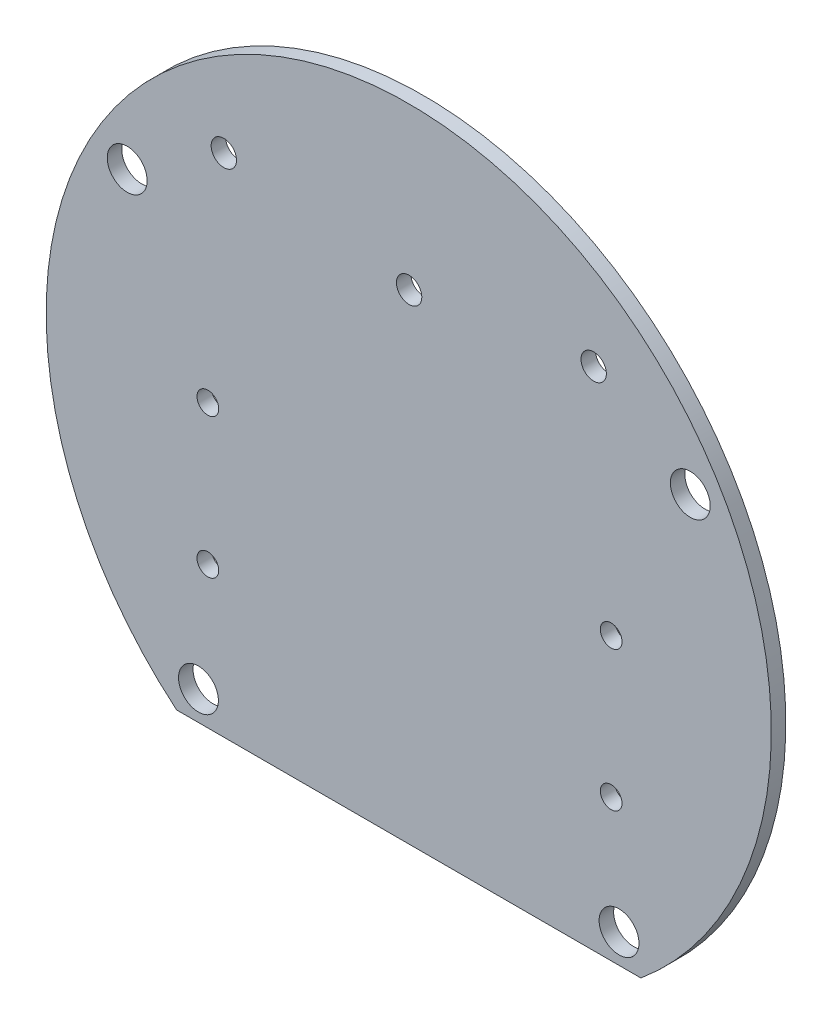
ISO-10303-21;
HEADER;
FILE_DESCRIPTION(('STEP AP214'),'2;1');
FILE_NAME('part.step','',(''),(''),'','','');
FILE_SCHEMA(('AUTOMOTIVE_DESIGN { 1 0 10303 214 1 1 1 1 }'));
ENDSEC;
DATA;
#1=APPLICATION_CONTEXT('core data for automotive mechanical design processes');
#2=APPLICATION_PROTOCOL_DEFINITION('international standard','automotive_design',2000,#1);
#3=PRODUCT_CONTEXT('',#1,'mechanical');
#4=PRODUCT('Part','Part','',(#3));
#5=PRODUCT_RELATED_PRODUCT_CATEGORY('part','',(#4));
#6=PRODUCT_DEFINITION_FORMATION('','',#4);
#7=PRODUCT_DEFINITION_CONTEXT('part definition',#1,'design');
#8=PRODUCT_DEFINITION('design','',#6,#7);
#9=PRODUCT_DEFINITION_SHAPE('','',#8);
#10=(LENGTH_UNIT() NAMED_UNIT(*) SI_UNIT(.MILLI.,.METRE.));
#11=(NAMED_UNIT(*) PLANE_ANGLE_UNIT() SI_UNIT($,.RADIAN.));
#12=(NAMED_UNIT(*) SI_UNIT($,.STERADIAN.) SOLID_ANGLE_UNIT());
#13=UNCERTAINTY_MEASURE_WITH_UNIT(LENGTH_MEASURE(1.E-05),#10,'distance_accuracy_value','');
#14=(GEOMETRIC_REPRESENTATION_CONTEXT(3) GLOBAL_UNCERTAINTY_ASSIGNED_CONTEXT((#13)) GLOBAL_UNIT_ASSIGNED_CONTEXT((#10,
#11,#12)) REPRESENTATION_CONTEXT('',''));
#15=CARTESIAN_POINT('',(0.,0.,0.));
#16=DIRECTION('',(0.,0.,1.));
#17=DIRECTION('',(1.,0.,0.));
#18=AXIS2_PLACEMENT_3D('',#15,#16,#17);
#19=CARTESIAN_POINT('',(0.,0.,2.));
#20=DIRECTION('',(0.,0.,-1.));
#21=DIRECTION('',(-1.,0.,0.));
#22=AXIS2_PLACEMENT_3D('',#19,#20,#21);
#23=CYLINDRICAL_SURFACE('',#22,50.);
#24=DIRECTION('',(0.,0.,-1.));
#25=VECTOR('',#24,1.);
#26=CARTESIAN_POINT('',(-32.0113353588168,-38.4093010681705,2.));
#27=LINE('',#26,#25);
#28=CARTESIAN_POINT('',(-32.0113353588168,-38.4093010681705,2.));
#29=VERTEX_POINT('',#28);
#30=CARTESIAN_POINT('',(-32.0113353588168,-38.4093010681705,0.));
#31=VERTEX_POINT('',#30);
#32=EDGE_CURVE('E55',#29,#31,#27,.T.);
#33=ORIENTED_EDGE('',*,*,#32,.F.);
#34=CARTESIAN_POINT('',(0.,0.,2.));
#35=DIRECTION('',(0.,0.,1.));
#36=DIRECTION('',(1.,0.,0.));
#37=AXIS2_PLACEMENT_3D('',#34,#35,#36);
#38=CIRCLE('',#37,50.);
#39=CARTESIAN_POINT('',(32.0113353588168,-38.4093010681705,2.));
#40=VERTEX_POINT('',#39);
#41=EDGE_CURVE('E49',#40,#29,#38,.T.);
#42=ORIENTED_EDGE('',*,*,#41,.F.);
#43=DIRECTION('',(0.,0.,-1.));
#44=VECTOR('',#43,1.);
#45=CARTESIAN_POINT('',(32.0113353588168,-38.4093010681705,2.));
#46=LINE('',#45,#44);
#47=CARTESIAN_POINT('',(32.0113353588168,-38.4093010681705,0.));
#48=VERTEX_POINT('',#47);
#49=EDGE_CURVE('E66',#48,#40,#46,.F.);
#50=ORIENTED_EDGE('',*,*,#49,.F.);
#51=CARTESIAN_POINT('',(0.,0.,0.));
#52=DIRECTION('',(0.,0.,1.));
#53=DIRECTION('',(1.,0.,0.));
#54=AXIS2_PLACEMENT_3D('',#51,#52,#53);
#55=CIRCLE('',#54,50.);
#56=EDGE_CURVE('E72',#48,#31,#55,.T.);
#57=ORIENTED_EDGE('',*,*,#56,.T.);
#58=EDGE_LOOP('',(#33,#42,#50,#57));
#59=FACE_BOUND('',#58,.T.);
#60=ADVANCED_FACE('F41',(#59),#23,.T.);
#61=CARTESIAN_POINT('',(0.,0.,2.));
#62=DIRECTION('',(0.,0.,1.));
#63=DIRECTION('',(1.,0.,0.));
#64=AXIS2_PLACEMENT_3D('',#61,#62,#63);
#65=PLANE('',#64);
#66=CARTESIAN_POINT('',(25.5,31.36,2.));
#67=DIRECTION('',(0.,0.,1.));
#68=DIRECTION('',(1.,0.,0.));
#69=AXIS2_PLACEMENT_3D('',#66,#67,#68);
#70=CIRCLE('',#69,1.75);
#71=CARTESIAN_POINT('',(27.25,31.36,2.));
#72=VERTEX_POINT('',#71);
#73=EDGE_CURVE('E75',#72,#72,#70,.T.);
#74=ORIENTED_EDGE('',*,*,#73,.F.);
#75=EDGE_LOOP('',(#74));
#76=FACE_BOUND('',#75,.T.);
#77=CARTESIAN_POINT('',(-25.5,31.36,2.));
#78=DIRECTION('',(0.,0.,1.));
#79=DIRECTION('',(1.,0.,0.));
#80=AXIS2_PLACEMENT_3D('',#77,#78,#79);
#81=CIRCLE('',#80,1.75);
#82=CARTESIAN_POINT('',(-23.75,31.36,2.));
#83=VERTEX_POINT('',#82);
#84=EDGE_CURVE('E121',#83,#83,#81,.T.);
#85=ORIENTED_EDGE('',*,*,#84,.F.);
#86=EDGE_LOOP('',(#85));
#87=FACE_BOUND('',#86,.T.);
#88=CARTESIAN_POINT('',(27.91,0.439999999999989,2.));
#89=DIRECTION('',(0.,0.,1.));
#90=DIRECTION('',(1.,0.,0.));
#91=AXIS2_PLACEMENT_3D('',#88,#89,#90);
#92=CIRCLE('',#91,1.5);
#93=CARTESIAN_POINT('',(29.41,0.439999999999989,2.));
#94=VERTEX_POINT('',#93);
#95=EDGE_CURVE('E125',#94,#94,#92,.T.);
#96=ORIENTED_EDGE('',*,*,#95,.F.);
#97=EDGE_LOOP('',(#96));
#98=FACE_BOUND('',#97,.T.);
#99=CARTESIAN_POINT('',(-27.7,0.439999999999996,2.));
#100=DIRECTION('',(0.,0.,1.));
#101=DIRECTION('',(1.,0.,0.));
#102=AXIS2_PLACEMENT_3D('',#99,#100,#101);
#103=CIRCLE('',#102,1.5);
#104=CARTESIAN_POINT('',(-26.2,0.439999999999996,2.));
#105=VERTEX_POINT('',#104);
#106=EDGE_CURVE('E129',#105,#105,#103,.T.);
#107=ORIENTED_EDGE('',*,*,#106,.F.);
#108=EDGE_LOOP('',(#107));
#109=FACE_BOUND('',#108,.T.);
#110=CARTESIAN_POINT('',(-27.7,-18.86,2.));
#111=DIRECTION('',(0.,0.,1.));
#112=DIRECTION('',(1.,0.,0.));
#113=AXIS2_PLACEMENT_3D('',#110,#111,#112);
#114=CIRCLE('',#113,1.5);
#115=CARTESIAN_POINT('',(-26.2,-18.86,2.));
#116=VERTEX_POINT('',#115);
#117=EDGE_CURVE('E133',#116,#116,#114,.T.);
#118=ORIENTED_EDGE('',*,*,#117,.F.);
#119=EDGE_LOOP('',(#118));
#120=FACE_BOUND('',#119,.T.);
#121=CARTESIAN_POINT('',(27.91,-18.86,2.));
#122=DIRECTION('',(0.,0.,1.));
#123=DIRECTION('',(1.,0.,0.));
#124=AXIS2_PLACEMENT_3D('',#121,#122,#123);
#125=CIRCLE('',#124,1.5);
#126=CARTESIAN_POINT('',(29.41,-18.86,2.));
#127=VERTEX_POINT('',#126);
#128=EDGE_CURVE('E137',#127,#127,#125,.T.);
#129=ORIENTED_EDGE('',*,*,#128,.F.);
#130=EDGE_LOOP('',(#129));
#131=FACE_BOUND('',#130,.T.);
#132=CARTESIAN_POINT('',(0.0499999999999968,27.79,2.));
#133=DIRECTION('',(0.,0.,1.));
#134=DIRECTION('',(1.,0.,0.));
#135=AXIS2_PLACEMENT_3D('',#132,#133,#134);
#136=CIRCLE('',#135,1.75);
#137=CARTESIAN_POINT('',(1.8,27.79,2.));
#138=VERTEX_POINT('',#137);
#139=EDGE_CURVE('E141',#138,#138,#136,.T.);
#140=ORIENTED_EDGE('',*,*,#139,.F.);
#141=EDGE_LOOP('',(#140));
#142=FACE_BOUND('',#141,.T.);
#143=CARTESIAN_POINT('',(38.8241975308642,22.7526193235952,2.));
#144=DIRECTION('',(0.,0.,1.));
#145=DIRECTION('',(1.,0.,0.));
#146=AXIS2_PLACEMENT_3D('',#143,#144,#145);
#147=CIRCLE('',#146,2.75);
#148=CARTESIAN_POINT('',(41.5741975308642,22.7526193235952,2.));
#149=VERTEX_POINT('',#148);
#150=EDGE_CURVE('E91',#149,#149,#147,.T.);
#151=ORIENTED_EDGE('',*,*,#150,.F.);
#152=EDGE_LOOP('',(#151));
#153=FACE_BOUND('',#152,.T.);
#154=CARTESIAN_POINT('',(-38.8241975308642,22.7526193235952,2.));
#155=DIRECTION('',(0.,0.,1.));
#156=DIRECTION('',(1.,0.,0.));
#157=AXIS2_PLACEMENT_3D('',#154,#155,#156);
#158=CIRCLE('',#157,2.75);
#159=CARTESIAN_POINT('',(-36.0741975308642,22.7526193235952,2.));
#160=VERTEX_POINT('',#159);
#161=EDGE_CURVE('E99',#160,#160,#158,.T.);
#162=ORIENTED_EDGE('',*,*,#161,.F.);
#163=EDGE_LOOP('',(#162));
#164=FACE_BOUND('',#163,.T.);
#165=CARTESIAN_POINT('',(29.,-34.4093010681705,2.));
#166=DIRECTION('',(0.,0.,1.));
#167=DIRECTION('',(1.,0.,0.));
#168=AXIS2_PLACEMENT_3D('',#165,#166,#167);
#169=CIRCLE('',#168,2.75);
#170=CARTESIAN_POINT('',(31.75,-34.4093010681705,2.));
#171=VERTEX_POINT('',#170);
#172=EDGE_CURVE('E107',#171,#171,#169,.T.);
#173=ORIENTED_EDGE('',*,*,#172,.F.);
#174=EDGE_LOOP('',(#173));
#175=FACE_BOUND('',#174,.T.);
#176=CARTESIAN_POINT('',(-29.,-34.4093010681705,2.));
#177=DIRECTION('',(0.,0.,1.));
#178=DIRECTION('',(1.,0.,0.));
#179=AXIS2_PLACEMENT_3D('',#176,#177,#178);
#180=CIRCLE('',#179,2.75);
#181=CARTESIAN_POINT('',(-26.25,-34.4093010681705,2.));
#182=VERTEX_POINT('',#181);
#183=EDGE_CURVE('E84',#182,#182,#180,.T.);
#184=ORIENTED_EDGE('',*,*,#183,.F.);
#185=EDGE_LOOP('',(#184));
#186=FACE_BOUND('',#185,.T.);
#187=ORIENTED_EDGE('',*,*,#41,.T.);
#188=DIRECTION('',(1.,0.,0.));
#189=VECTOR('',#188,1.);
#190=CARTESIAN_POINT('',(0.,-38.4093010681705,2.));
#191=LINE('',#190,#189);
#192=EDGE_CURVE('E60',#29,#40,#191,.T.);
#193=ORIENTED_EDGE('',*,*,#192,.T.);
#194=EDGE_LOOP('',(#187,#193));
#195=FACE_BOUND('',#194,.T.);
#196=ADVANCED_FACE('F179',(#76,#87,#98,#109,#120,#131,#142,#153,#164,#175,#186,#195),#65,.T.);
#197=CARTESIAN_POINT('',(0.,0.,0.));
#198=DIRECTION('',(0.,0.,1.));
#199=DIRECTION('',(1.,0.,0.));
#200=AXIS2_PLACEMENT_3D('',#197,#198,#199);
#201=PLANE('',#200);
#202=CARTESIAN_POINT('',(25.5,31.36,0.));
#203=DIRECTION('',(0.,0.,-1.));
#204=DIRECTION('',(-1.,0.,0.));
#205=AXIS2_PLACEMENT_3D('',#202,#203,#204);
#206=CIRCLE('',#205,1.75);
#207=CARTESIAN_POINT('',(23.75,31.36,0.));
#208=VERTEX_POINT('',#207);
#209=EDGE_CURVE('E150',#208,#208,#206,.T.);
#210=ORIENTED_EDGE('',*,*,#209,.F.);
#211=EDGE_LOOP('',(#210));
#212=FACE_BOUND('',#211,.T.);
#213=CARTESIAN_POINT('',(-25.5,31.36,0.));
#214=DIRECTION('',(0.,0.,-1.));
#215=DIRECTION('',(-1.,0.,0.));
#216=AXIS2_PLACEMENT_3D('',#213,#214,#215);
#217=CIRCLE('',#216,1.75);
#218=CARTESIAN_POINT('',(-27.25,31.36,0.));
#219=VERTEX_POINT('',#218);
#220=EDGE_CURVE('E154',#219,#219,#217,.T.);
#221=ORIENTED_EDGE('',*,*,#220,.F.);
#222=EDGE_LOOP('',(#221));
#223=FACE_BOUND('',#222,.T.);
#224=CARTESIAN_POINT('',(27.91,0.439999999999989,0.));
#225=DIRECTION('',(0.,0.,-1.));
#226=DIRECTION('',(-1.,0.,0.));
#227=AXIS2_PLACEMENT_3D('',#224,#225,#226);
#228=CIRCLE('',#227,1.5);
#229=CARTESIAN_POINT('',(26.41,0.439999999999989,0.));
#230=VERTEX_POINT('',#229);
#231=EDGE_CURVE('E158',#230,#230,#228,.T.);
#232=ORIENTED_EDGE('',*,*,#231,.F.);
#233=EDGE_LOOP('',(#232));
#234=FACE_BOUND('',#233,.T.);
#235=CARTESIAN_POINT('',(-27.7,0.439999999999996,0.));
#236=DIRECTION('',(0.,0.,-1.));
#237=DIRECTION('',(-1.,0.,0.));
#238=AXIS2_PLACEMENT_3D('',#235,#236,#237);
#239=CIRCLE('',#238,1.5);
#240=CARTESIAN_POINT('',(-29.2,0.439999999999996,0.));
#241=VERTEX_POINT('',#240);
#242=EDGE_CURVE('E162',#241,#241,#239,.T.);
#243=ORIENTED_EDGE('',*,*,#242,.F.);
#244=EDGE_LOOP('',(#243));
#245=FACE_BOUND('',#244,.T.);
#246=CARTESIAN_POINT('',(-27.7,-18.86,0.));
#247=DIRECTION('',(0.,0.,-1.));
#248=DIRECTION('',(-1.,0.,0.));
#249=AXIS2_PLACEMENT_3D('',#246,#247,#248);
#250=CIRCLE('',#249,1.5);
#251=CARTESIAN_POINT('',(-29.2,-18.86,0.));
#252=VERTEX_POINT('',#251);
#253=EDGE_CURVE('E166',#252,#252,#250,.T.);
#254=ORIENTED_EDGE('',*,*,#253,.F.);
#255=EDGE_LOOP('',(#254));
#256=FACE_BOUND('',#255,.T.);
#257=CARTESIAN_POINT('',(27.91,-18.86,0.));
#258=DIRECTION('',(0.,0.,-1.));
#259=DIRECTION('',(-1.,0.,0.));
#260=AXIS2_PLACEMENT_3D('',#257,#258,#259);
#261=CIRCLE('',#260,1.5);
#262=CARTESIAN_POINT('',(26.41,-18.86,0.));
#263=VERTEX_POINT('',#262);
#264=EDGE_CURVE('E149',#263,#263,#261,.T.);
#265=ORIENTED_EDGE('',*,*,#264,.F.);
#266=EDGE_LOOP('',(#265));
#267=FACE_BOUND('',#266,.T.);
#268=CARTESIAN_POINT('',(0.0499999999999968,27.79,0.));
#269=DIRECTION('',(0.,0.,-1.));
#270=DIRECTION('',(-1.,0.,0.));
#271=AXIS2_PLACEMENT_3D('',#268,#269,#270);
#272=CIRCLE('',#271,1.75);
#273=CARTESIAN_POINT('',(-1.7,27.79,0.));
#274=VERTEX_POINT('',#273);
#275=EDGE_CURVE('E145',#274,#274,#272,.T.);
#276=ORIENTED_EDGE('',*,*,#275,.F.);
#277=EDGE_LOOP('',(#276));
#278=FACE_BOUND('',#277,.T.);
#279=CARTESIAN_POINT('',(-29.,-34.4093010681705,0.));
#280=DIRECTION('',(0.,0.,1.));
#281=DIRECTION('',(1.,0.,0.));
#282=AXIS2_PLACEMENT_3D('',#279,#280,#281);
#283=CIRCLE('',#282,2.75);
#284=CARTESIAN_POINT('',(-26.25,-34.4093010681705,0.));
#285=VERTEX_POINT('',#284);
#286=EDGE_CURVE('E79',#285,#285,#283,.T.);
#287=ORIENTED_EDGE('',*,*,#286,.T.);
#288=EDGE_LOOP('',(#287));
#289=FACE_BOUND('',#288,.T.);
#290=CARTESIAN_POINT('',(29.,-34.4093010681705,0.));
#291=DIRECTION('',(0.,0.,1.));
#292=DIRECTION('',(1.,0.,0.));
#293=AXIS2_PLACEMENT_3D('',#290,#291,#292);
#294=CIRCLE('',#293,2.75);
#295=CARTESIAN_POINT('',(31.75,-34.4093010681705,0.));
#296=VERTEX_POINT('',#295);
#297=EDGE_CURVE('E89',#296,#296,#294,.T.);
#298=ORIENTED_EDGE('',*,*,#297,.T.);
#299=EDGE_LOOP('',(#298));
#300=FACE_BOUND('',#299,.T.);
#301=CARTESIAN_POINT('',(-38.8241975308642,22.7526193235952,0.));
#302=DIRECTION('',(0.,0.,1.));
#303=DIRECTION('',(1.,0.,0.));
#304=AXIS2_PLACEMENT_3D('',#301,#302,#303);
#305=CIRCLE('',#304,2.75);
#306=CARTESIAN_POINT('',(-36.0741975308642,22.7526193235952,0.));
#307=VERTEX_POINT('',#306);
#308=EDGE_CURVE('E103',#307,#307,#305,.T.);
#309=ORIENTED_EDGE('',*,*,#308,.T.);
#310=EDGE_LOOP('',(#309));
#311=FACE_BOUND('',#310,.T.);
#312=CARTESIAN_POINT('',(38.8241975308642,22.7526193235952,0.));
#313=DIRECTION('',(0.,0.,1.));
#314=DIRECTION('',(1.,0.,0.));
#315=AXIS2_PLACEMENT_3D('',#312,#313,#314);
#316=CIRCLE('',#315,2.75);
#317=CARTESIAN_POINT('',(41.5741975308642,22.7526193235952,0.));
#318=VERTEX_POINT('',#317);
#319=EDGE_CURVE('E95',#318,#318,#316,.T.);
#320=ORIENTED_EDGE('',*,*,#319,.T.);
#321=EDGE_LOOP('',(#320));
#322=FACE_BOUND('',#321,.T.);
#323=DIRECTION('',(1.,0.,0.));
#324=VECTOR('',#323,1.);
#325=CARTESIAN_POINT('',(0.,-38.4093010681705,0.));
#326=LINE('',#325,#324);
#327=EDGE_CURVE('E11',#31,#48,#326,.T.);
#328=ORIENTED_EDGE('',*,*,#327,.F.);
#329=ORIENTED_EDGE('',*,*,#56,.F.);
#330=EDGE_LOOP('',(#328,#329));
#331=FACE_BOUND('',#330,.T.);
#332=ADVANCED_FACE('F77',(#212,#223,#234,#245,#256,#267,#278,#289,#300,#311,#322,#331),#201,.F.);
#333=CARTESIAN_POINT('',(-29.,-34.4093010681705,0.));
#334=DIRECTION('',(0.,0.,1.));
#335=DIRECTION('',(1.,0.,0.));
#336=AXIS2_PLACEMENT_3D('',#333,#334,#335);
#337=CYLINDRICAL_SURFACE('',#336,2.75);
#338=ORIENTED_EDGE('',*,*,#286,.F.);
#339=EDGE_LOOP('',(#338));
#340=FACE_BOUND('',#339,.T.);
#341=ORIENTED_EDGE('',*,*,#183,.T.);
#342=EDGE_LOOP('',(#341));
#343=FACE_BOUND('',#342,.T.);
#344=ADVANCED_FACE('F178',(#340,#343),#337,.F.);
#345=CARTESIAN_POINT('',(29.,-34.4093010681705,0.));
#346=DIRECTION('',(0.,0.,1.));
#347=DIRECTION('',(1.,0.,0.));
#348=AXIS2_PLACEMENT_3D('',#345,#346,#347);
#349=CYLINDRICAL_SURFACE('',#348,2.75);
#350=ORIENTED_EDGE('',*,*,#297,.F.);
#351=EDGE_LOOP('',(#350));
#352=FACE_BOUND('',#351,.T.);
#353=ORIENTED_EDGE('',*,*,#172,.T.);
#354=EDGE_LOOP('',(#353));
#355=FACE_BOUND('',#354,.T.);
#356=ADVANCED_FACE('F210',(#352,#355),#349,.F.);
#357=CARTESIAN_POINT('',(-38.8241975308642,22.7526193235952,0.));
#358=DIRECTION('',(0.,0.,1.));
#359=DIRECTION('',(1.,0.,0.));
#360=AXIS2_PLACEMENT_3D('',#357,#358,#359);
#361=CYLINDRICAL_SURFACE('',#360,2.75);
#362=ORIENTED_EDGE('',*,*,#308,.F.);
#363=EDGE_LOOP('',(#362));
#364=FACE_BOUND('',#363,.T.);
#365=ORIENTED_EDGE('',*,*,#161,.T.);
#366=EDGE_LOOP('',(#365));
#367=FACE_BOUND('',#366,.T.);
#368=ADVANCED_FACE('F194',(#364,#367),#361,.F.);
#369=CARTESIAN_POINT('',(38.8241975308642,22.7526193235952,0.));
#370=DIRECTION('',(0.,0.,1.));
#371=DIRECTION('',(1.,0.,0.));
#372=AXIS2_PLACEMENT_3D('',#369,#370,#371);
#373=CYLINDRICAL_SURFACE('',#372,2.75);
#374=ORIENTED_EDGE('',*,*,#319,.F.);
#375=EDGE_LOOP('',(#374));
#376=FACE_BOUND('',#375,.T.);
#377=ORIENTED_EDGE('',*,*,#150,.T.);
#378=EDGE_LOOP('',(#377));
#379=FACE_BOUND('',#378,.T.);
#380=ADVANCED_FACE('F191',(#376,#379),#373,.F.);
#381=CARTESIAN_POINT('',(-40.7238599785686,-38.4093010681705,2.000012));
#382=DIRECTION('',(0.,-1.,0.));
#383=DIRECTION('',(0.,0.,-1.));
#384=AXIS2_PLACEMENT_3D('',#381,#382,#383);
#385=PLANE('',#384);
#386=ORIENTED_EDGE('',*,*,#32,.T.);
#387=ORIENTED_EDGE('',*,*,#327,.T.);
#388=ORIENTED_EDGE('',*,*,#49,.T.);
#389=ORIENTED_EDGE('',*,*,#192,.F.);
#390=EDGE_LOOP('',(#386,#387,#388,#389));
#391=FACE_BOUND('',#390,.T.);
#392=ADVANCED_FACE('F65',(#391),#385,.T.);
#393=CARTESIAN_POINT('',(0.0499999999999968,27.79,10.));
#394=DIRECTION('',(0.,0.,-1.));
#395=DIRECTION('',(-1.,0.,0.));
#396=AXIS2_PLACEMENT_3D('',#393,#394,#395);
#397=CYLINDRICAL_SURFACE('',#396,1.75);
#398=ORIENTED_EDGE('',*,*,#139,.T.);
#399=EDGE_LOOP('',(#398));
#400=FACE_BOUND('',#399,.T.);
#401=ORIENTED_EDGE('',*,*,#275,.T.);
#402=EDGE_LOOP('',(#401));
#403=FACE_BOUND('',#402,.T.);
#404=ADVANCED_FACE('F238',(#400,#403),#397,.F.);
#405=CARTESIAN_POINT('',(27.91,-18.86,10.));
#406=DIRECTION('',(0.,0.,-1.));
#407=DIRECTION('',(-1.,0.,0.));
#408=AXIS2_PLACEMENT_3D('',#405,#406,#407);
#409=CYLINDRICAL_SURFACE('',#408,1.5);
#410=ORIENTED_EDGE('',*,*,#128,.T.);
#411=EDGE_LOOP('',(#410));
#412=FACE_BOUND('',#411,.T.);
#413=ORIENTED_EDGE('',*,*,#264,.T.);
#414=EDGE_LOOP('',(#413));
#415=FACE_BOUND('',#414,.T.);
#416=ADVANCED_FACE('F174',(#412,#415),#409,.F.);
#417=CARTESIAN_POINT('',(-27.7,-18.86,10.));
#418=DIRECTION('',(0.,0.,-1.));
#419=DIRECTION('',(-1.,0.,0.));
#420=AXIS2_PLACEMENT_3D('',#417,#418,#419);
#421=CYLINDRICAL_SURFACE('',#420,1.5);
#422=ORIENTED_EDGE('',*,*,#117,.T.);
#423=EDGE_LOOP('',(#422));
#424=FACE_BOUND('',#423,.T.);
#425=ORIENTED_EDGE('',*,*,#253,.T.);
#426=EDGE_LOOP('',(#425));
#427=FACE_BOUND('',#426,.T.);
#428=ADVANCED_FACE('F256',(#424,#427),#421,.F.);
#429=CARTESIAN_POINT('',(-27.7,0.439999999999996,10.));
#430=DIRECTION('',(0.,0.,-1.));
#431=DIRECTION('',(-1.,0.,0.));
#432=AXIS2_PLACEMENT_3D('',#429,#430,#431);
#433=CYLINDRICAL_SURFACE('',#432,1.5);
#434=ORIENTED_EDGE('',*,*,#106,.T.);
#435=EDGE_LOOP('',(#434));
#436=FACE_BOUND('',#435,.T.);
#437=ORIENTED_EDGE('',*,*,#242,.T.);
#438=EDGE_LOOP('',(#437));
#439=FACE_BOUND('',#438,.T.);
#440=ADVANCED_FACE('F264',(#436,#439),#433,.F.);
#441=CARTESIAN_POINT('',(27.91,0.439999999999989,10.));
#442=DIRECTION('',(0.,0.,-1.));
#443=DIRECTION('',(-1.,0.,0.));
#444=AXIS2_PLACEMENT_3D('',#441,#442,#443);
#445=CYLINDRICAL_SURFACE('',#444,1.5);
#446=ORIENTED_EDGE('',*,*,#95,.T.);
#447=EDGE_LOOP('',(#446));
#448=FACE_BOUND('',#447,.T.);
#449=ORIENTED_EDGE('',*,*,#231,.T.);
#450=EDGE_LOOP('',(#449));
#451=FACE_BOUND('',#450,.T.);
#452=ADVANCED_FACE('F272',(#448,#451),#445,.F.);
#453=CARTESIAN_POINT('',(-25.5,31.36,10.));
#454=DIRECTION('',(0.,0.,-1.));
#455=DIRECTION('',(-1.,0.,0.));
#456=AXIS2_PLACEMENT_3D('',#453,#454,#455);
#457=CYLINDRICAL_SURFACE('',#456,1.75);
#458=ORIENTED_EDGE('',*,*,#84,.T.);
#459=EDGE_LOOP('',(#458));
#460=FACE_BOUND('',#459,.T.);
#461=ORIENTED_EDGE('',*,*,#220,.T.);
#462=EDGE_LOOP('',(#461));
#463=FACE_BOUND('',#462,.T.);
#464=ADVANCED_FACE('F280',(#460,#463),#457,.F.);
#465=CARTESIAN_POINT('',(25.5,31.36,10.));
#466=DIRECTION('',(0.,0.,-1.));
#467=DIRECTION('',(-1.,0.,0.));
#468=AXIS2_PLACEMENT_3D('',#465,#466,#467);
#469=CYLINDRICAL_SURFACE('',#468,1.75);
#470=ORIENTED_EDGE('',*,*,#73,.T.);
#471=EDGE_LOOP('',(#470));
#472=FACE_BOUND('',#471,.T.);
#473=ORIENTED_EDGE('',*,*,#209,.T.);
#474=EDGE_LOOP('',(#473));
#475=FACE_BOUND('',#474,.T.);
#476=ADVANCED_FACE('F288',(#472,#475),#469,.F.);
#477=CLOSED_SHELL('',(#60,#196,#332,#344,#356,#368,#380,#392,#404,#416,#428,#440,#452,#464,#476));
#478=MANIFOLD_SOLID_BREP('B2',#477);
#479=ADVANCED_BREP_SHAPE_REPRESENTATION('',(#18,#478),#14);
#480=SHAPE_DEFINITION_REPRESENTATION(#9,#479);
ENDSEC;
END-ISO-10303-21;
